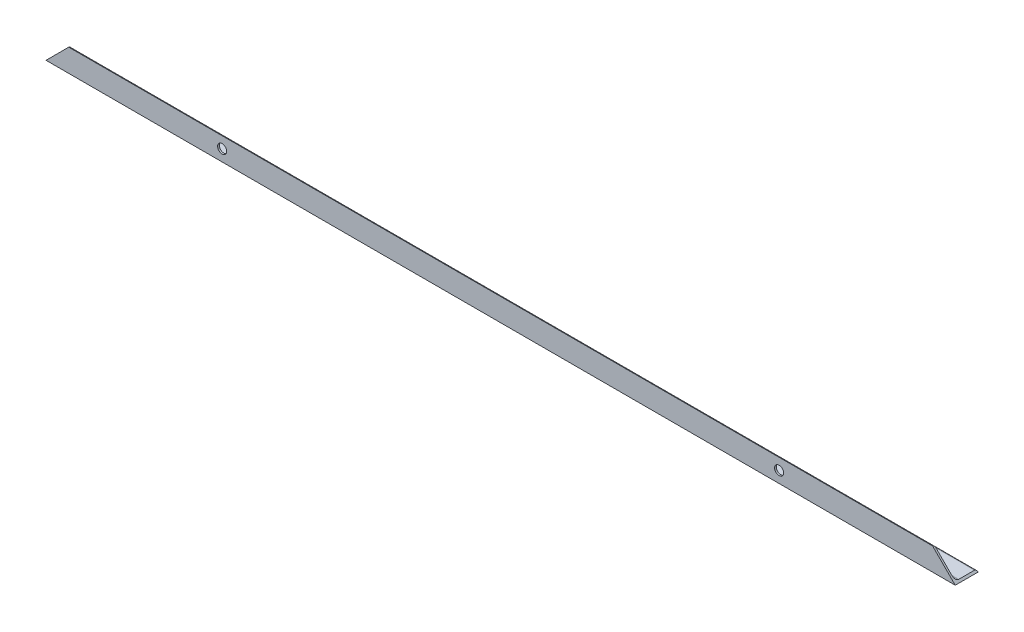
ISO-10303-21;
HEADER;
FILE_DESCRIPTION(('STEP AP214'),'2;1');
FILE_NAME('part.step','',(''),(''),'','','');
FILE_SCHEMA(('AUTOMOTIVE_DESIGN { 1 0 10303 214 1 1 1 1 }'));
ENDSEC;
DATA;
#1=APPLICATION_CONTEXT('core data for automotive mechanical design processes');
#2=APPLICATION_PROTOCOL_DEFINITION('international standard','automotive_design',2000,#1);
#3=PRODUCT_CONTEXT('',#1,'mechanical');
#4=PRODUCT('Part','Part','',(#3));
#5=PRODUCT_RELATED_PRODUCT_CATEGORY('part','',(#4));
#6=PRODUCT_DEFINITION_FORMATION('','',#4);
#7=PRODUCT_DEFINITION_CONTEXT('part definition',#1,'design');
#8=PRODUCT_DEFINITION('design','',#6,#7);
#9=PRODUCT_DEFINITION_SHAPE('','',#8);
#10=(LENGTH_UNIT() NAMED_UNIT(*) SI_UNIT(.MILLI.,.METRE.));
#11=(NAMED_UNIT(*) PLANE_ANGLE_UNIT() SI_UNIT($,.RADIAN.));
#12=(NAMED_UNIT(*) SI_UNIT($,.STERADIAN.) SOLID_ANGLE_UNIT());
#13=UNCERTAINTY_MEASURE_WITH_UNIT(LENGTH_MEASURE(1.E-05),#10,'distance_accuracy_value','');
#14=(GEOMETRIC_REPRESENTATION_CONTEXT(3) GLOBAL_UNCERTAINTY_ASSIGNED_CONTEXT((#13)) GLOBAL_UNIT_ASSIGNED_CONTEXT((#10,
#11,#12)) REPRESENTATION_CONTEXT('',''));
#15=CARTESIAN_POINT('',(0.,0.,0.));
#16=DIRECTION('',(0.,0.,1.));
#17=DIRECTION('',(1.,0.,0.));
#18=AXIS2_PLACEMENT_3D('',#15,#16,#17);
#19=CARTESIAN_POINT('',(1600.,0.,-40.));
#20=DIRECTION('',(0.,1.,0.));
#21=DIRECTION('',(0.,0.,1.));
#22=AXIS2_PLACEMENT_3D('',#19,#20,#21);
#23=PLANE('',#22);
#24=DIRECTION('',(0.,0.,-1.));
#25=VECTOR('',#24,1.);
#26=CARTESIAN_POINT('',(0.,0.,-40.));
#27=LINE('',#26,#25);
#28=CARTESIAN_POINT('',(0.,0.,0.));
#29=VERTEX_POINT('',#28);
#30=CARTESIAN_POINT('',(0.,0.,-40.));
#31=VERTEX_POINT('',#30);
#32=EDGE_CURVE('E119',#29,#31,#27,.T.);
#33=ORIENTED_EDGE('',*,*,#32,.T.);
#34=DIRECTION('',(-1.,0.,0.));
#35=VECTOR('',#34,1.);
#36=CARTESIAN_POINT('',(1600.,0.,-40.));
#37=LINE('',#36,#35);
#38=CARTESIAN_POINT('',(1600.,0.,-40.));
#39=VERTEX_POINT('',#38);
#40=EDGE_CURVE('E13',#39,#31,#37,.T.);
#41=ORIENTED_EDGE('',*,*,#40,.F.);
#42=DIRECTION('',(0.,0.,-1.));
#43=VECTOR('',#42,1.);
#44=CARTESIAN_POINT('',(1600.,0.,-40.));
#45=LINE('',#44,#43);
#46=CARTESIAN_POINT('',(1600.,0.,0.));
#47=VERTEX_POINT('',#46);
#48=EDGE_CURVE('E130',#47,#39,#45,.T.);
#49=ORIENTED_EDGE('',*,*,#48,.F.);
#50=DIRECTION('',(-1.,0.,0.));
#51=VECTOR('',#50,1.);
#52=CARTESIAN_POINT('',(1600.,0.,0.));
#53=LINE('',#52,#51);
#54=EDGE_CURVE('E136',#47,#29,#53,.T.);
#55=ORIENTED_EDGE('',*,*,#54,.T.);
#56=EDGE_LOOP('',(#33,#41,#49,#55));
#57=FACE_BOUND('',#56,.T.);
#58=ADVANCED_FACE('F65',(#57),#23,.F.);
#59=CARTESIAN_POINT('',(1600.,0.,-37.));
#60=DIRECTION('',(-1.,0.,0.));
#61=DIRECTION('',(0.,0.,1.));
#62=AXIS2_PLACEMENT_3D('',#59,#60,#61);
#63=CYLINDRICAL_SURFACE('',#62,3.);
#64=ORIENTED_EDGE('',*,*,#40,.T.);
#65=CARTESIAN_POINT('',(2.22044604925031E-13,0.,-37.));
#66=DIRECTION('',(0.707106781186548,-0.707106781186548,0.));
#67=DIRECTION('',(-0.707106781186548,-0.707106781186548,0.));
#68=AXIS2_PLACEMENT_3D('',#65,#66,#67);
#69=ELLIPSE('',#68,4.24264068711928,3.);
#70=CARTESIAN_POINT('',(3.00000000000011,3.,-37.));
#71=VERTEX_POINT('',#70);
#72=EDGE_CURVE('E125',#31,#71,#69,.T.);
#73=ORIENTED_EDGE('',*,*,#72,.T.);
#74=DIRECTION('',(-1.,0.,0.));
#75=VECTOR('',#74,1.);
#76=CARTESIAN_POINT('',(1600.,3.,-37.));
#77=LINE('',#76,#75);
#78=CARTESIAN_POINT('',(1597.,3.,-37.));
#79=VERTEX_POINT('',#78);
#80=EDGE_CURVE('E74',#79,#71,#77,.T.);
#81=ORIENTED_EDGE('',*,*,#80,.F.);
#82=CARTESIAN_POINT('',(1600.,0.,-37.));
#83=DIRECTION('',(-0.70710678118655,-0.707106781186545,0.));
#84=DIRECTION('',(-0.707106781186545,0.70710678118655,0.));
#85=AXIS2_PLACEMENT_3D('',#82,#83,#84);
#86=ELLIPSE('',#85,4.24264068711927,3.);
#87=EDGE_CURVE('E174',#79,#39,#86,.T.);
#88=ORIENTED_EDGE('',*,*,#87,.T.);
#89=EDGE_LOOP('',(#64,#73,#81,#88));
#90=FACE_BOUND('',#89,.T.);
#91=ADVANCED_FACE('F173',(#90),#63,.T.);
#92=CARTESIAN_POINT('',(1600.,3.,-9.));
#93=DIRECTION('',(0.,-1.,0.));
#94=DIRECTION('',(0.,0.,-1.));
#95=AXIS2_PLACEMENT_3D('',#92,#93,#94);
#96=PLANE('',#95);
#97=ORIENTED_EDGE('',*,*,#80,.T.);
#98=DIRECTION('',(0.,0.,1.));
#99=VECTOR('',#98,1.);
#100=CARTESIAN_POINT('',(3.00000000000011,3.,-9.));
#101=LINE('',#100,#99);
#102=CARTESIAN_POINT('',(3.00000000000034,3.,-9.00000000000001));
#103=VERTEX_POINT('',#102);
#104=EDGE_CURVE('E169',#71,#103,#101,.T.);
#105=ORIENTED_EDGE('',*,*,#104,.T.);
#106=DIRECTION('',(-1.,0.,0.));
#107=VECTOR('',#106,1.);
#108=CARTESIAN_POINT('',(1600.,3.,-9.00000000000001));
#109=LINE('',#108,#107);
#110=CARTESIAN_POINT('',(1597.,3.,-9.00000000000001));
#111=VERTEX_POINT('',#110);
#112=EDGE_CURVE('E158',#111,#103,#109,.T.);
#113=ORIENTED_EDGE('',*,*,#112,.F.);
#114=DIRECTION('',(0.,0.,-1.));
#115=VECTOR('',#114,1.);
#116=CARTESIAN_POINT('',(1597.,3.,-9.));
#117=LINE('',#116,#115);
#118=EDGE_CURVE('E170',#111,#79,#117,.T.);
#119=ORIENTED_EDGE('',*,*,#118,.T.);
#120=EDGE_LOOP('',(#97,#105,#113,#119));
#121=FACE_BOUND('',#120,.T.);
#122=ADVANCED_FACE('F167',(#121),#96,.F.);
#123=CARTESIAN_POINT('',(1600.,9.,-9.));
#124=DIRECTION('',(-1.,0.,0.));
#125=DIRECTION('',(0.,0.,1.));
#126=AXIS2_PLACEMENT_3D('',#123,#124,#125);
#127=CYLINDRICAL_SURFACE('',#126,6.);
#128=ORIENTED_EDGE('',*,*,#112,.T.);
#129=CARTESIAN_POINT('',(9.00000000000012,9.,-9.));
#130=DIRECTION('',(0.707106781186548,-0.707106781186548,0.));
#131=DIRECTION('',(-0.707106781186548,-0.707106781186548,0.));
#132=AXIS2_PLACEMENT_3D('',#129,#130,#131);
#133=ELLIPSE('',#132,8.48528137423857,6.);
#134=CARTESIAN_POINT('',(8.9999999999999,9.00000000000001,-3.));
#135=VERTEX_POINT('',#134);
#136=EDGE_CURVE('E183',#103,#135,#133,.F.);
#137=ORIENTED_EDGE('',*,*,#136,.T.);
#138=DIRECTION('',(-1.,0.,0.));
#139=VECTOR('',#138,1.);
#140=CARTESIAN_POINT('',(1600.,9.,-3.));
#141=LINE('',#140,#139);
#142=CARTESIAN_POINT('',(1591.,9.,-3.));
#143=VERTEX_POINT('',#142);
#144=EDGE_CURVE('E154',#143,#135,#141,.T.);
#145=ORIENTED_EDGE('',*,*,#144,.F.);
#146=CARTESIAN_POINT('',(1591.,9.,-9.));
#147=DIRECTION('',(-0.70710678118655,-0.707106781186545,0.));
#148=DIRECTION('',(-0.707106781186545,0.70710678118655,0.));
#149=AXIS2_PLACEMENT_3D('',#146,#147,#148);
#150=ELLIPSE('',#149,8.48528137423855,6.);
#151=EDGE_CURVE('E190',#143,#111,#150,.F.);
#152=ORIENTED_EDGE('',*,*,#151,.T.);
#153=EDGE_LOOP('',(#128,#137,#145,#152));
#154=FACE_BOUND('',#153,.T.);
#155=ADVANCED_FACE('F230',(#154),#127,.F.);
#156=CARTESIAN_POINT('',(1600.,37.,-3.));
#157=DIRECTION('',(0.,0.,1.));
#158=DIRECTION('',(1.,0.,0.));
#159=AXIS2_PLACEMENT_3D('',#156,#157,#158);
#160=PLANE('',#159);
#161=CARTESIAN_POINT('',(1290.,20.0000000000001,-3.));
#162=DIRECTION('',(0.,0.,1.));
#163=DIRECTION('',(1.,0.,0.));
#164=AXIS2_PLACEMENT_3D('',#161,#162,#163);
#165=CIRCLE('',#164,7.99999999999998);
#166=CARTESIAN_POINT('',(1298.,20.0000000000001,-3.));
#167=VERTEX_POINT('',#166);
#168=EDGE_CURVE('E131',#167,#167,#165,.T.);
#169=ORIENTED_EDGE('',*,*,#168,.T.);
#170=EDGE_LOOP('',(#169));
#171=FACE_BOUND('',#170,.T.);
#172=CARTESIAN_POINT('',(310.,20.0000000000001,-3.));
#173=DIRECTION('',(0.,0.,1.));
#174=DIRECTION('',(1.,0.,0.));
#175=AXIS2_PLACEMENT_3D('',#172,#173,#174);
#176=CIRCLE('',#175,7.99999999999998);
#177=CARTESIAN_POINT('',(318.,20.0000000000001,-3.));
#178=VERTEX_POINT('',#177);
#179=EDGE_CURVE('E198',#178,#178,#176,.T.);
#180=ORIENTED_EDGE('',*,*,#179,.T.);
#181=EDGE_LOOP('',(#180));
#182=FACE_BOUND('',#181,.T.);
#183=ORIENTED_EDGE('',*,*,#144,.T.);
#184=DIRECTION('',(0.707106781186548,0.707106781186548,0.));
#185=VECTOR('',#184,1.);
#186=CARTESIAN_POINT('',(818.5,818.5,-3.));
#187=LINE('',#186,#185);
#188=CARTESIAN_POINT('',(36.9999999999999,37.,-3.));
#189=VERTEX_POINT('',#188);
#190=EDGE_CURVE('E253',#135,#189,#187,.T.);
#191=ORIENTED_EDGE('',*,*,#190,.T.);
#192=DIRECTION('',(-1.,0.,0.));
#193=VECTOR('',#192,1.);
#194=CARTESIAN_POINT('',(1600.,37.,-3.));
#195=LINE('',#194,#193);
#196=CARTESIAN_POINT('',(1563.,37.,-3.));
#197=VERTEX_POINT('',#196);
#198=EDGE_CURVE('E147',#197,#189,#195,.T.);
#199=ORIENTED_EDGE('',*,*,#198,.F.);
#200=DIRECTION('',(0.707106781186545,-0.70710678118655,0.));
#201=VECTOR('',#200,1.);
#202=CARTESIAN_POINT('',(1581.5,18.5000000000001,-3.));
#203=LINE('',#202,#201);
#204=EDGE_CURVE('E181',#197,#143,#203,.T.);
#205=ORIENTED_EDGE('',*,*,#204,.T.);
#206=EDGE_LOOP('',(#183,#191,#199,#205));
#207=FACE_BOUND('',#206,.T.);
#208=ADVANCED_FACE('F206',(#171,#182,#207),#160,.F.);
#209=CARTESIAN_POINT('',(1600.,37.,0.));
#210=DIRECTION('',(-1.,0.,0.));
#211=DIRECTION('',(0.,0.,1.));
#212=AXIS2_PLACEMENT_3D('',#209,#210,#211);
#213=CYLINDRICAL_SURFACE('',#212,3.);
#214=ORIENTED_EDGE('',*,*,#198,.T.);
#215=CARTESIAN_POINT('',(36.9999999999999,37.,0.));
#216=DIRECTION('',(0.707106781186548,-0.707106781186548,0.));
#217=DIRECTION('',(-0.707106781186548,-0.707106781186548,0.));
#218=AXIS2_PLACEMENT_3D('',#215,#216,#217);
#219=ELLIPSE('',#218,4.24264068711929,3.);
#220=CARTESIAN_POINT('',(40.,40.,0.));
#221=VERTEX_POINT('',#220);
#222=EDGE_CURVE('E141',#189,#221,#219,.T.);
#223=ORIENTED_EDGE('',*,*,#222,.T.);
#224=DIRECTION('',(-1.,0.,0.));
#225=VECTOR('',#224,1.);
#226=CARTESIAN_POINT('',(1600.,40.,0.));
#227=LINE('',#226,#225);
#228=CARTESIAN_POINT('',(1560.,40.0000000000003,0.));
#229=VERTEX_POINT('',#228);
#230=EDGE_CURVE('E139',#229,#221,#227,.T.);
#231=ORIENTED_EDGE('',*,*,#230,.F.);
#232=CARTESIAN_POINT('',(1563.,37.,0.));
#233=DIRECTION('',(-0.70710678118655,-0.707106781186545,0.));
#234=DIRECTION('',(-0.707106781186545,0.70710678118655,0.));
#235=AXIS2_PLACEMENT_3D('',#232,#233,#234);
#236=ELLIPSE('',#235,4.24264068711927,3.);
#237=EDGE_CURVE('E176',#229,#197,#236,.T.);
#238=ORIENTED_EDGE('',*,*,#237,.T.);
#239=EDGE_LOOP('',(#214,#223,#231,#238));
#240=FACE_BOUND('',#239,.T.);
#241=ADVANCED_FACE('F238',(#240),#213,.T.);
#242=CARTESIAN_POINT('',(1600.,40.,0.));
#243=DIRECTION('',(0.,0.,-1.));
#244=DIRECTION('',(-1.,0.,0.));
#245=AXIS2_PLACEMENT_3D('',#242,#243,#244);
#246=PLANE('',#245);
#247=CARTESIAN_POINT('',(1290.,20.0000000000001,0.));
#248=DIRECTION('',(0.,0.,1.));
#249=DIRECTION('',(1.,0.,0.));
#250=AXIS2_PLACEMENT_3D('',#247,#248,#249);
#251=CIRCLE('',#250,7.99999999999998);
#252=CARTESIAN_POINT('',(1298.,20.0000000000001,0.));
#253=VERTEX_POINT('',#252);
#254=EDGE_CURVE('E264',#253,#253,#251,.T.);
#255=ORIENTED_EDGE('',*,*,#254,.F.);
#256=EDGE_LOOP('',(#255));
#257=FACE_BOUND('',#256,.T.);
#258=CARTESIAN_POINT('',(310.,20.0000000000001,0.));
#259=DIRECTION('',(0.,0.,1.));
#260=DIRECTION('',(1.,0.,0.));
#261=AXIS2_PLACEMENT_3D('',#258,#259,#260);
#262=CIRCLE('',#261,7.99999999999998);
#263=CARTESIAN_POINT('',(318.,20.0000000000001,0.));
#264=VERTEX_POINT('',#263);
#265=EDGE_CURVE('E259',#264,#264,#262,.T.);
#266=ORIENTED_EDGE('',*,*,#265,.F.);
#267=EDGE_LOOP('',(#266));
#268=FACE_BOUND('',#267,.T.);
#269=ORIENTED_EDGE('',*,*,#230,.T.);
#270=DIRECTION('',(0.707106781186548,0.707106781186548,0.));
#271=VECTOR('',#270,1.);
#272=CARTESIAN_POINT('',(40.,40.,0.));
#273=LINE('',#272,#271);
#274=EDGE_CURVE('E122',#29,#221,#273,.T.);
#275=ORIENTED_EDGE('',*,*,#274,.F.);
#276=ORIENTED_EDGE('',*,*,#54,.F.);
#277=DIRECTION('',(0.707106781186545,-0.70710678118655,0.));
#278=VECTOR('',#277,1.);
#279=CARTESIAN_POINT('',(1560.,40.0000000000003,0.));
#280=LINE('',#279,#278);
#281=EDGE_CURVE('E80',#229,#47,#280,.T.);
#282=ORIENTED_EDGE('',*,*,#281,.F.);
#283=EDGE_LOOP('',(#269,#275,#276,#282));
#284=FACE_BOUND('',#283,.T.);
#285=ADVANCED_FACE('F135',(#257,#268,#284),#246,.F.);
#286=CARTESIAN_POINT('',(40.,40.,-40.));
#287=DIRECTION('',(0.707106781186548,-0.707106781186548,0.));
#288=DIRECTION('',(0.707106781186548,0.707106781186548,0.));
#289=AXIS2_PLACEMENT_3D('',#286,#287,#288);
#290=PLANE('',#289);
#291=ORIENTED_EDGE('',*,*,#32,.F.);
#292=ORIENTED_EDGE('',*,*,#274,.T.);
#293=ORIENTED_EDGE('',*,*,#222,.F.);
#294=ORIENTED_EDGE('',*,*,#190,.F.);
#295=ORIENTED_EDGE('',*,*,#136,.F.);
#296=ORIENTED_EDGE('',*,*,#104,.F.);
#297=ORIENTED_EDGE('',*,*,#72,.F.);
#298=EDGE_LOOP('',(#291,#292,#293,#294,#295,#296,#297));
#299=FACE_BOUND('',#298,.T.);
#300=ADVANCED_FACE('F121',(#299),#290,.F.);
#301=CARTESIAN_POINT('',(1560.,40.0000000000003,-40.));
#302=DIRECTION('',(-0.70710678118655,-0.707106781186545,0.));
#303=DIRECTION('',(0.707106781186545,-0.70710678118655,0.));
#304=AXIS2_PLACEMENT_3D('',#301,#302,#303);
#305=PLANE('',#304);
#306=ORIENTED_EDGE('',*,*,#118,.F.);
#307=ORIENTED_EDGE('',*,*,#151,.F.);
#308=ORIENTED_EDGE('',*,*,#204,.F.);
#309=ORIENTED_EDGE('',*,*,#237,.F.);
#310=ORIENTED_EDGE('',*,*,#281,.T.);
#311=ORIENTED_EDGE('',*,*,#48,.T.);
#312=ORIENTED_EDGE('',*,*,#87,.F.);
#313=EDGE_LOOP('',(#306,#307,#308,#309,#310,#311,#312));
#314=FACE_BOUND('',#313,.T.);
#315=ADVANCED_FACE('F217',(#314),#305,.F.);
#316=CARTESIAN_POINT('',(310.,20.0000000000001,-40.));
#317=DIRECTION('',(0.,0.,1.));
#318=DIRECTION('',(1.,0.,0.));
#319=AXIS2_PLACEMENT_3D('',#316,#317,#318);
#320=CYLINDRICAL_SURFACE('',#319,7.99999999999998);
#321=ORIENTED_EDGE('',*,*,#265,.T.);
#322=EDGE_LOOP('',(#321));
#323=FACE_BOUND('',#322,.T.);
#324=ORIENTED_EDGE('',*,*,#179,.F.);
#325=EDGE_LOOP('',(#324));
#326=FACE_BOUND('',#325,.T.);
#327=ADVANCED_FACE('F211',(#323,#326),#320,.F.);
#328=CARTESIAN_POINT('',(1290.,20.0000000000001,-40.));
#329=DIRECTION('',(0.,0.,1.));
#330=DIRECTION('',(1.,0.,0.));
#331=AXIS2_PLACEMENT_3D('',#328,#329,#330);
#332=CYLINDRICAL_SURFACE('',#331,7.99999999999998);
#333=ORIENTED_EDGE('',*,*,#254,.T.);
#334=EDGE_LOOP('',(#333));
#335=FACE_BOUND('',#334,.T.);
#336=ORIENTED_EDGE('',*,*,#168,.F.);
#337=EDGE_LOOP('',(#336));
#338=FACE_BOUND('',#337,.T.);
#339=ADVANCED_FACE('F209',(#335,#338),#332,.F.);
#340=CLOSED_SHELL('',(#58,#91,#122,#155,#208,#241,#285,#300,#315,#327,#339));
#341=MANIFOLD_SOLID_BREP('B2',#340);
#342=ADVANCED_BREP_SHAPE_REPRESENTATION('',(#18,#341),#14);
#343=SHAPE_DEFINITION_REPRESENTATION(#9,#342);
ENDSEC;
END-ISO-10303-21;
